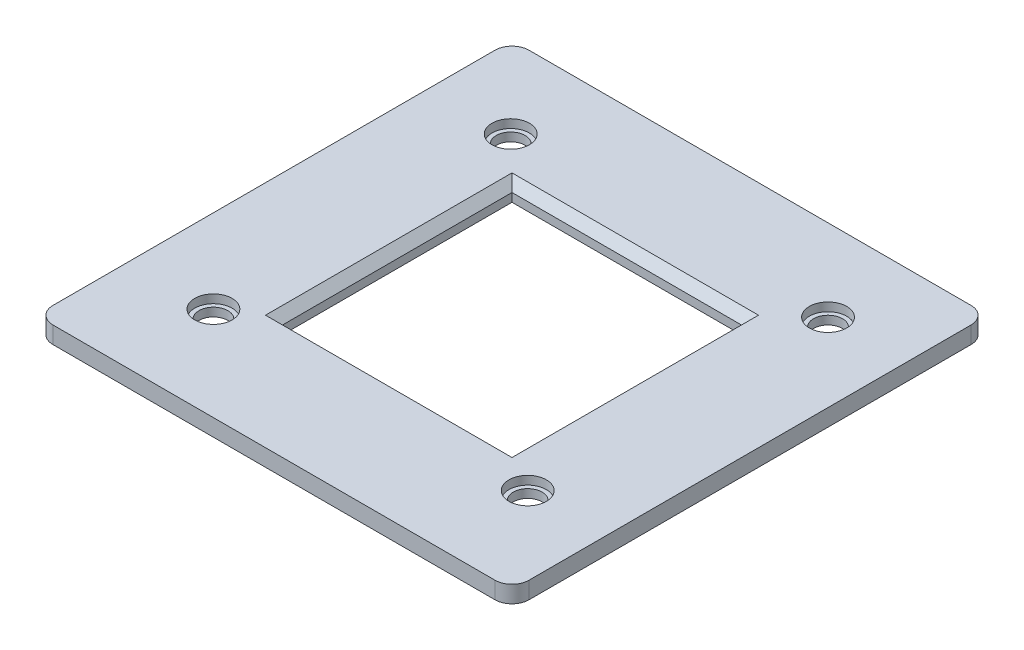
ISO-10303-21;
HEADER;
FILE_DESCRIPTION(('STEP AP214'),'2;1');
FILE_NAME('part.step','',(''),(''),'','','');
FILE_SCHEMA(('AUTOMOTIVE_DESIGN { 1 0 10303 214 1 1 1 1 }'));
ENDSEC;
DATA;
#1=APPLICATION_CONTEXT('core data for automotive mechanical design processes');
#2=APPLICATION_PROTOCOL_DEFINITION('international standard','automotive_design',2000,#1);
#3=PRODUCT_CONTEXT('',#1,'mechanical');
#4=PRODUCT('Part','Part','',(#3));
#5=PRODUCT_RELATED_PRODUCT_CATEGORY('part','',(#4));
#6=PRODUCT_DEFINITION_FORMATION('','',#4);
#7=PRODUCT_DEFINITION_CONTEXT('part definition',#1,'design');
#8=PRODUCT_DEFINITION('design','',#6,#7);
#9=PRODUCT_DEFINITION_SHAPE('','',#8);
#10=(LENGTH_UNIT() NAMED_UNIT(*) SI_UNIT(.MILLI.,.METRE.));
#11=(NAMED_UNIT(*) PLANE_ANGLE_UNIT() SI_UNIT($,.RADIAN.));
#12=(NAMED_UNIT(*) SI_UNIT($,.STERADIAN.) SOLID_ANGLE_UNIT());
#13=UNCERTAINTY_MEASURE_WITH_UNIT(LENGTH_MEASURE(1.E-05),#10,'distance_accuracy_value','');
#14=(GEOMETRIC_REPRESENTATION_CONTEXT(3) GLOBAL_UNCERTAINTY_ASSIGNED_CONTEXT((#13)) GLOBAL_UNIT_ASSIGNED_CONTEXT((#10,
#11,#12)) REPRESENTATION_CONTEXT('',''));
#15=CARTESIAN_POINT('',(0.,0.,0.));
#16=DIRECTION('',(0.,0.,1.));
#17=DIRECTION('',(1.,0.,0.));
#18=AXIS2_PLACEMENT_3D('',#15,#16,#17);
#19=CARTESIAN_POINT('',(0.,2.,0.));
#20=DIRECTION('',(0.,-1.,0.));
#21=DIRECTION('',(0.,0.,-1.));
#22=AXIS2_PLACEMENT_3D('',#19,#20,#21);
#23=PLANE('',#22);
#24=CARTESIAN_POINT('',(9.46189987263134,2.,-46.3842569727847));
#25=DIRECTION('',(0.,1.,0.));
#26=DIRECTION('',(0.,0.,1.));
#27=AXIS2_PLACEMENT_3D('',#24,#25,#26);
#28=CIRCLE('',#27,2.2);
#29=CARTESIAN_POINT('',(9.46189987263134,2.,-44.1842569727847));
#30=VERTEX_POINT('',#29);
#31=EDGE_CURVE('E618',#30,#30,#28,.T.);
#32=ORIENTED_EDGE('',*,*,#31,.F.);
#33=EDGE_LOOP('',(#32));
#34=FACE_BOUND('',#33,.T.);
#35=CARTESIAN_POINT('',(46.7945053850086,2.,-46.3842569727847));
#36=DIRECTION('',(0.,1.,0.));
#37=DIRECTION('',(0.,0.,1.));
#38=AXIS2_PLACEMENT_3D('',#35,#36,#37);
#39=CIRCLE('',#38,2.2);
#40=CARTESIAN_POINT('',(46.7945053850086,2.,-44.1842569727847));
#41=VERTEX_POINT('',#40);
#42=EDGE_CURVE('E235',#41,#41,#39,.T.);
#43=ORIENTED_EDGE('',*,*,#42,.F.);
#44=EDGE_LOOP('',(#43));
#45=FACE_BOUND('',#44,.T.);
#46=CARTESIAN_POINT('',(46.7945053850086,2.,-11.0516124699991));
#47=DIRECTION('',(0.,1.,0.));
#48=DIRECTION('',(0.,0.,1.));
#49=AXIS2_PLACEMENT_3D('',#46,#47,#48);
#50=CIRCLE('',#49,2.2);
#51=CARTESIAN_POINT('',(46.7945053850086,2.,-8.85161246999906));
#52=VERTEX_POINT('',#51);
#53=EDGE_CURVE('E230',#52,#52,#50,.T.);
#54=ORIENTED_EDGE('',*,*,#53,.F.);
#55=EDGE_LOOP('',(#54));
#56=FACE_BOUND('',#55,.T.);
#57=CARTESIAN_POINT('',(9.82086723332727,2.,-11.0516124699991));
#58=DIRECTION('',(0.,1.,0.));
#59=DIRECTION('',(0.,0.,1.));
#60=AXIS2_PLACEMENT_3D('',#57,#58,#59);
#61=CIRCLE('',#60,2.2);
#62=CARTESIAN_POINT('',(9.82086723332727,2.,-8.85161246999906));
#63=VERTEX_POINT('',#62);
#64=EDGE_CURVE('E225',#63,#63,#61,.T.);
#65=ORIENTED_EDGE('',*,*,#64,.F.);
#66=EDGE_LOOP('',(#65));
#67=FACE_BOUND('',#66,.T.);
#68=DIRECTION('',(1.,0.,0.));
#69=VECTOR('',#68,1.);
#70=CARTESIAN_POINT('',(41.5,2.,-42.5));
#71=LINE('',#70,#69);
#72=CARTESIAN_POINT('',(13.5,2.,-42.5));
#73=VERTEX_POINT('',#72);
#74=CARTESIAN_POINT('',(42.5,2.,-42.5));
#75=VERTEX_POINT('',#74);
#76=EDGE_CURVE('E198',#73,#75,#71,.T.);
#77=ORIENTED_EDGE('',*,*,#76,.T.);
#78=DIRECTION('',(0.,0.,1.));
#79=VECTOR('',#78,1.);
#80=CARTESIAN_POINT('',(42.5,2.,-14.5));
#81=LINE('',#80,#79);
#82=CARTESIAN_POINT('',(42.5,2.,-13.5));
#83=VERTEX_POINT('',#82);
#84=EDGE_CURVE('E204',#75,#83,#81,.T.);
#85=ORIENTED_EDGE('',*,*,#84,.T.);
#86=DIRECTION('',(-1.,0.,0.));
#87=VECTOR('',#86,1.);
#88=CARTESIAN_POINT('',(14.5,2.,-13.5));
#89=LINE('',#88,#87);
#90=CARTESIAN_POINT('',(13.5,2.,-13.5));
#91=VERTEX_POINT('',#90);
#92=EDGE_CURVE('E202',#83,#91,#89,.T.);
#93=ORIENTED_EDGE('',*,*,#92,.T.);
#94=DIRECTION('',(0.,0.,-1.));
#95=VECTOR('',#94,1.);
#96=CARTESIAN_POINT('',(13.5,2.,-41.5));
#97=LINE('',#96,#95);
#98=EDGE_CURVE('E200',#91,#73,#97,.T.);
#99=ORIENTED_EDGE('',*,*,#98,.T.);
#100=EDGE_LOOP('',(#77,#85,#93,#99));
#101=FACE_BOUND('',#100,.T.);
#102=DIRECTION('',(0.,0.,-1.));
#103=VECTOR('',#102,1.);
#104=CARTESIAN_POINT('',(56.,2.,0.));
#105=LINE('',#104,#103);
#106=CARTESIAN_POINT('',(56.,2.,-2.));
#107=VERTEX_POINT('',#106);
#108=CARTESIAN_POINT('',(56.,2.,-54.));
#109=VERTEX_POINT('',#108);
#110=EDGE_CURVE('E180',#107,#109,#105,.T.);
#111=ORIENTED_EDGE('',*,*,#110,.T.);
#112=CARTESIAN_POINT('',(54.,2.,-54.));
#113=DIRECTION('',(0.,-1.,0.));
#114=DIRECTION('',(0.,0.,-1.));
#115=AXIS2_PLACEMENT_3D('',#112,#113,#114);
#116=CIRCLE('',#115,2.);
#117=CARTESIAN_POINT('',(54.,2.,-56.));
#118=VERTEX_POINT('',#117);
#119=EDGE_CURVE('E259',#109,#118,#116,.F.);
#120=ORIENTED_EDGE('',*,*,#119,.T.);
#121=DIRECTION('',(-1.,0.,0.));
#122=VECTOR('',#121,1.);
#123=CARTESIAN_POINT('',(0.,2.,-56.));
#124=LINE('',#123,#122);
#125=CARTESIAN_POINT('',(2.,2.,-56.));
#126=VERTEX_POINT('',#125);
#127=EDGE_CURVE('E183',#118,#126,#124,.T.);
#128=ORIENTED_EDGE('',*,*,#127,.T.);
#129=CARTESIAN_POINT('',(2.,2.,-54.));
#130=DIRECTION('',(0.,-1.,0.));
#131=DIRECTION('',(0.,0.,-1.));
#132=AXIS2_PLACEMENT_3D('',#129,#130,#131);
#133=CIRCLE('',#132,2.);
#134=CARTESIAN_POINT('',(0.,2.,-54.));
#135=VERTEX_POINT('',#134);
#136=EDGE_CURVE('E257',#126,#135,#133,.F.);
#137=ORIENTED_EDGE('',*,*,#136,.T.);
#138=DIRECTION('',(0.,0.,1.));
#139=VECTOR('',#138,1.);
#140=CARTESIAN_POINT('',(0.,2.,0.));
#141=LINE('',#140,#139);
#142=CARTESIAN_POINT('',(0.,2.,-2.));
#143=VERTEX_POINT('',#142);
#144=EDGE_CURVE('E175',#135,#143,#141,.T.);
#145=ORIENTED_EDGE('',*,*,#144,.T.);
#146=CARTESIAN_POINT('',(2.,2.,-2.));
#147=DIRECTION('',(0.,-1.,0.));
#148=DIRECTION('',(0.,0.,-1.));
#149=AXIS2_PLACEMENT_3D('',#146,#147,#148);
#150=CIRCLE('',#149,2.);
#151=CARTESIAN_POINT('',(2.,2.,0.));
#152=VERTEX_POINT('',#151);
#153=EDGE_CURVE('E52',#143,#152,#150,.F.);
#154=ORIENTED_EDGE('',*,*,#153,.T.);
#155=DIRECTION('',(1.,0.,0.));
#156=VECTOR('',#155,1.);
#157=CARTESIAN_POINT('',(0.,2.,0.));
#158=LINE('',#157,#156);
#159=CARTESIAN_POINT('',(54.,2.,0.));
#160=VERTEX_POINT('',#159);
#161=EDGE_CURVE('E177',#152,#160,#158,.T.);
#162=ORIENTED_EDGE('',*,*,#161,.T.);
#163=CARTESIAN_POINT('',(54.,2.,-2.));
#164=DIRECTION('',(0.,-1.,0.));
#165=DIRECTION('',(0.,0.,-1.));
#166=AXIS2_PLACEMENT_3D('',#163,#164,#165);
#167=CIRCLE('',#166,2.);
#168=EDGE_CURVE('E255',#160,#107,#167,.F.);
#169=ORIENTED_EDGE('',*,*,#168,.T.);
#170=EDGE_LOOP('',(#111,#120,#128,#137,#145,#154,#162,#169));
#171=FACE_BOUND('',#170,.T.);
#172=ADVANCED_FACE('F32',(#34,#45,#56,#67,#101,#171),#23,.F.);
#173=CARTESIAN_POINT('',(0.,0.,0.));
#174=DIRECTION('',(0.,-1.,0.));
#175=DIRECTION('',(0.,0.,-1.));
#176=AXIS2_PLACEMENT_3D('',#173,#174,#175);
#177=PLANE('',#176);
#178=CARTESIAN_POINT('',(9.46189987263134,0.,-46.3842569727847));
#179=DIRECTION('',(0.,-1.,0.));
#180=DIRECTION('',(0.,0.,-1.));
#181=AXIS2_PLACEMENT_3D('',#178,#179,#180);
#182=CIRCLE('',#181,1.7);
#183=CARTESIAN_POINT('',(9.46189987263134,0.,-48.0842569727847));
#184=VERTEX_POINT('',#183);
#185=EDGE_CURVE('E232',#184,#184,#182,.T.);
#186=ORIENTED_EDGE('',*,*,#185,.F.);
#187=EDGE_LOOP('',(#186));
#188=FACE_BOUND('',#187,.T.);
#189=CARTESIAN_POINT('',(46.7945053850086,0.,-46.3842569727847));
#190=DIRECTION('',(0.,-1.,0.));
#191=DIRECTION('',(0.,0.,-1.));
#192=AXIS2_PLACEMENT_3D('',#189,#190,#191);
#193=CIRCLE('',#192,1.7);
#194=CARTESIAN_POINT('',(46.7945053850086,0.,-48.0842569727847));
#195=VERTEX_POINT('',#194);
#196=EDGE_CURVE('E227',#195,#195,#193,.T.);
#197=ORIENTED_EDGE('',*,*,#196,.F.);
#198=EDGE_LOOP('',(#197));
#199=FACE_BOUND('',#198,.T.);
#200=CARTESIAN_POINT('',(46.7945053850086,0.,-11.0516124699991));
#201=DIRECTION('',(0.,-1.,0.));
#202=DIRECTION('',(0.,0.,-1.));
#203=AXIS2_PLACEMENT_3D('',#200,#201,#202);
#204=CIRCLE('',#203,1.7);
#205=CARTESIAN_POINT('',(46.7945053850086,0.,-12.7516124699991));
#206=VERTEX_POINT('',#205);
#207=EDGE_CURVE('E222',#206,#206,#204,.T.);
#208=ORIENTED_EDGE('',*,*,#207,.F.);
#209=EDGE_LOOP('',(#208));
#210=FACE_BOUND('',#209,.T.);
#211=CARTESIAN_POINT('',(9.82086723332727,0.,-11.0516124699991));
#212=DIRECTION('',(0.,-1.,0.));
#213=DIRECTION('',(0.,0.,-1.));
#214=AXIS2_PLACEMENT_3D('',#211,#212,#213);
#215=CIRCLE('',#214,1.7);
#216=CARTESIAN_POINT('',(9.82086723332727,0.,-12.7516124699991));
#217=VERTEX_POINT('',#216);
#218=EDGE_CURVE('E216',#217,#217,#215,.T.);
#219=ORIENTED_EDGE('',*,*,#218,.F.);
#220=EDGE_LOOP('',(#219));
#221=FACE_BOUND('',#220,.T.);
#222=DIRECTION('',(-1.,0.,0.));
#223=VECTOR('',#222,1.);
#224=CARTESIAN_POINT('',(0.,0.,-56.));
#225=LINE('',#224,#223);
#226=CARTESIAN_POINT('',(54.,0.,-56.));
#227=VERTEX_POINT('',#226);
#228=CARTESIAN_POINT('',(2.,0.,-56.));
#229=VERTEX_POINT('',#228);
#230=EDGE_CURVE('E178',#227,#229,#225,.T.);
#231=ORIENTED_EDGE('',*,*,#230,.F.);
#232=CARTESIAN_POINT('',(54.,0.,-54.));
#233=DIRECTION('',(0.,-1.,0.));
#234=DIRECTION('',(0.,0.,-1.));
#235=AXIS2_PLACEMENT_3D('',#232,#233,#234);
#236=CIRCLE('',#235,2.);
#237=CARTESIAN_POINT('',(56.,0.,-54.));
#238=VERTEX_POINT('',#237);
#239=EDGE_CURVE('E247',#227,#238,#236,.T.);
#240=ORIENTED_EDGE('',*,*,#239,.T.);
#241=DIRECTION('',(0.,0.,-1.));
#242=VECTOR('',#241,1.);
#243=CARTESIAN_POINT('',(56.,0.,0.));
#244=LINE('',#243,#242);
#245=CARTESIAN_POINT('',(56.,0.,-2.));
#246=VERTEX_POINT('',#245);
#247=EDGE_CURVE('E191',#246,#238,#244,.T.);
#248=ORIENTED_EDGE('',*,*,#247,.F.);
#249=CARTESIAN_POINT('',(54.,0.,-2.));
#250=DIRECTION('',(0.,-1.,0.));
#251=DIRECTION('',(0.,0.,-1.));
#252=AXIS2_PLACEMENT_3D('',#249,#250,#251);
#253=CIRCLE('',#252,2.);
#254=CARTESIAN_POINT('',(54.,0.,0.));
#255=VERTEX_POINT('',#254);
#256=EDGE_CURVE('E243',#246,#255,#253,.T.);
#257=ORIENTED_EDGE('',*,*,#256,.T.);
#258=DIRECTION('',(1.,0.,0.));
#259=VECTOR('',#258,1.);
#260=CARTESIAN_POINT('',(0.,0.,0.));
#261=LINE('',#260,#259);
#262=CARTESIAN_POINT('',(2.,0.,0.));
#263=VERTEX_POINT('',#262);
#264=EDGE_CURVE('E189',#263,#255,#261,.T.);
#265=ORIENTED_EDGE('',*,*,#264,.F.);
#266=CARTESIAN_POINT('',(2.,0.,-2.));
#267=DIRECTION('',(0.,-1.,0.));
#268=DIRECTION('',(0.,0.,-1.));
#269=AXIS2_PLACEMENT_3D('',#266,#267,#268);
#270=CIRCLE('',#269,2.);
#271=CARTESIAN_POINT('',(0.,0.,-2.));
#272=VERTEX_POINT('',#271);
#273=EDGE_CURVE('E241',#263,#272,#270,.T.);
#274=ORIENTED_EDGE('',*,*,#273,.T.);
#275=DIRECTION('',(0.,0.,1.));
#276=VECTOR('',#275,1.);
#277=CARTESIAN_POINT('',(0.,0.,0.));
#278=LINE('',#277,#276);
#279=CARTESIAN_POINT('',(0.,0.,-54.));
#280=VERTEX_POINT('',#279);
#281=EDGE_CURVE('E144',#280,#272,#278,.T.);
#282=ORIENTED_EDGE('',*,*,#281,.F.);
#283=CARTESIAN_POINT('',(2.,0.,-54.));
#284=DIRECTION('',(0.,-1.,0.));
#285=DIRECTION('',(0.,0.,-1.));
#286=AXIS2_PLACEMENT_3D('',#283,#284,#285);
#287=CIRCLE('',#286,2.);
#288=EDGE_CURVE('E245',#280,#229,#287,.T.);
#289=ORIENTED_EDGE('',*,*,#288,.T.);
#290=EDGE_LOOP('',(#231,#240,#248,#257,#265,#274,#282,#289));
#291=FACE_BOUND('',#290,.T.);
#292=DIRECTION('',(-1.,0.,0.));
#293=VECTOR('',#292,1.);
#294=CARTESIAN_POINT('',(14.5,0.,-41.5));
#295=LINE('',#294,#293);
#296=CARTESIAN_POINT('',(41.5,0.,-41.5));
#297=VERTEX_POINT('',#296);
#298=CARTESIAN_POINT('',(14.5,0.,-41.5));
#299=VERTEX_POINT('',#298);
#300=EDGE_CURVE('E158',#297,#299,#295,.T.);
#301=ORIENTED_EDGE('',*,*,#300,.T.);
#302=DIRECTION('',(0.,0.,1.));
#303=VECTOR('',#302,1.);
#304=CARTESIAN_POINT('',(14.5,0.,-14.5));
#305=LINE('',#304,#303);
#306=CARTESIAN_POINT('',(14.5,0.,-14.5));
#307=VERTEX_POINT('',#306);
#308=EDGE_CURVE('E138',#299,#307,#305,.T.);
#309=ORIENTED_EDGE('',*,*,#308,.T.);
#310=DIRECTION('',(1.,0.,0.));
#311=VECTOR('',#310,1.);
#312=CARTESIAN_POINT('',(14.5,0.,-14.5));
#313=LINE('',#312,#311);
#314=CARTESIAN_POINT('',(41.5,0.,-14.5));
#315=VERTEX_POINT('',#314);
#316=EDGE_CURVE('E148',#307,#315,#313,.T.);
#317=ORIENTED_EDGE('',*,*,#316,.T.);
#318=DIRECTION('',(0.,0.,-1.));
#319=VECTOR('',#318,1.);
#320=CARTESIAN_POINT('',(41.5,0.,-14.5));
#321=LINE('',#320,#319);
#322=EDGE_CURVE('E154',#315,#297,#321,.T.);
#323=ORIENTED_EDGE('',*,*,#322,.T.);
#324=EDGE_LOOP('',(#301,#309,#317,#323));
#325=FACE_BOUND('',#324,.T.);
#326=ADVANCED_FACE('F156',(#188,#199,#210,#221,#291,#325),#177,.T.);
#327=CARTESIAN_POINT('',(0.,2.,0.));
#328=DIRECTION('',(1.,0.,0.));
#329=DIRECTION('',(0.,0.,-1.));
#330=AXIS2_PLACEMENT_3D('',#327,#328,#329);
#331=PLANE('',#330);
#332=ORIENTED_EDGE('',*,*,#144,.F.);
#333=DIRECTION('',(0.,-1.,0.));
#334=VECTOR('',#333,1.);
#335=CARTESIAN_POINT('',(0.,2.,-54.));
#336=LINE('',#335,#334);
#337=EDGE_CURVE('E263',#135,#280,#336,.T.);
#338=ORIENTED_EDGE('',*,*,#337,.T.);
#339=ORIENTED_EDGE('',*,*,#281,.T.);
#340=DIRECTION('',(0.,-1.,0.));
#341=VECTOR('',#340,1.);
#342=CARTESIAN_POINT('',(0.,2.,-2.));
#343=LINE('',#342,#341);
#344=EDGE_CURVE('E261',#272,#143,#343,.F.);
#345=ORIENTED_EDGE('',*,*,#344,.T.);
#346=EDGE_LOOP('',(#332,#338,#339,#345));
#347=FACE_BOUND('',#346,.T.);
#348=ADVANCED_FACE('F296',(#347),#331,.F.);
#349=CARTESIAN_POINT('',(0.,2.,0.));
#350=DIRECTION('',(0.,0.,-1.));
#351=DIRECTION('',(-1.,0.,0.));
#352=AXIS2_PLACEMENT_3D('',#349,#350,#351);
#353=PLANE('',#352);
#354=ORIENTED_EDGE('',*,*,#264,.T.);
#355=DIRECTION('',(0.,-1.,0.));
#356=VECTOR('',#355,1.);
#357=CARTESIAN_POINT('',(54.,2.,0.));
#358=LINE('',#357,#356);
#359=EDGE_CURVE('E11',#255,#160,#358,.F.);
#360=ORIENTED_EDGE('',*,*,#359,.T.);
#361=ORIENTED_EDGE('',*,*,#161,.F.);
#362=DIRECTION('',(0.,-1.,0.));
#363=VECTOR('',#362,1.);
#364=CARTESIAN_POINT('',(2.,2.,0.));
#365=LINE('',#364,#363);
#366=EDGE_CURVE('E40',#152,#263,#365,.T.);
#367=ORIENTED_EDGE('',*,*,#366,.T.);
#368=EDGE_LOOP('',(#354,#360,#361,#367));
#369=FACE_BOUND('',#368,.T.);
#370=ADVANCED_FACE('F268',(#369),#353,.F.);
#371=CARTESIAN_POINT('',(56.,2.,0.));
#372=DIRECTION('',(-1.,0.,0.));
#373=DIRECTION('',(0.,0.,1.));
#374=AXIS2_PLACEMENT_3D('',#371,#372,#373);
#375=PLANE('',#374);
#376=ORIENTED_EDGE('',*,*,#247,.T.);
#377=DIRECTION('',(0.,-1.,0.));
#378=VECTOR('',#377,1.);
#379=CARTESIAN_POINT('',(56.,2.,-54.));
#380=LINE('',#379,#378);
#381=EDGE_CURVE('E252',#238,#109,#380,.F.);
#382=ORIENTED_EDGE('',*,*,#381,.T.);
#383=ORIENTED_EDGE('',*,*,#110,.F.);
#384=DIRECTION('',(0.,-1.,0.));
#385=VECTOR('',#384,1.);
#386=CARTESIAN_POINT('',(56.,2.,-2.));
#387=LINE('',#386,#385);
#388=EDGE_CURVE('E249',#107,#246,#387,.T.);
#389=ORIENTED_EDGE('',*,*,#388,.T.);
#390=EDGE_LOOP('',(#376,#382,#383,#389));
#391=FACE_BOUND('',#390,.T.);
#392=ADVANCED_FACE('F280',(#391),#375,.F.);
#393=CARTESIAN_POINT('',(0.,2.,-56.));
#394=DIRECTION('',(0.,0.,1.));
#395=DIRECTION('',(1.,0.,0.));
#396=AXIS2_PLACEMENT_3D('',#393,#394,#395);
#397=PLANE('',#396);
#398=ORIENTED_EDGE('',*,*,#127,.F.);
#399=DIRECTION('',(0.,-1.,0.));
#400=VECTOR('',#399,1.);
#401=CARTESIAN_POINT('',(54.,2.,-56.));
#402=LINE('',#401,#400);
#403=EDGE_CURVE('E238',#118,#227,#402,.T.);
#404=ORIENTED_EDGE('',*,*,#403,.T.);
#405=ORIENTED_EDGE('',*,*,#230,.T.);
#406=DIRECTION('',(0.,-1.,0.));
#407=VECTOR('',#406,1.);
#408=CARTESIAN_POINT('',(2.,2.,-56.));
#409=LINE('',#408,#407);
#410=EDGE_CURVE('E212',#229,#126,#409,.F.);
#411=ORIENTED_EDGE('',*,*,#410,.T.);
#412=EDGE_LOOP('',(#398,#404,#405,#411));
#413=FACE_BOUND('',#412,.T.);
#414=ADVANCED_FACE('F288',(#413),#397,.F.);
#415=CARTESIAN_POINT('',(14.5,2.,-14.5));
#416=DIRECTION('',(1.,0.,0.));
#417=DIRECTION('',(0.,0.,-1.));
#418=AXIS2_PLACEMENT_3D('',#415,#416,#417);
#419=PLANE('',#418);
#420=DIRECTION('',(0.,-1.,0.));
#421=VECTOR('',#420,1.);
#422=CARTESIAN_POINT('',(14.5,2.,-41.5));
#423=LINE('',#422,#421);
#424=CARTESIAN_POINT('',(14.5,0.999999999999992,-41.5));
#425=VERTEX_POINT('',#424);
#426=EDGE_CURVE('E170',#425,#299,#423,.T.);
#427=ORIENTED_EDGE('',*,*,#426,.F.);
#428=DIRECTION('',(0.,0.,1.));
#429=VECTOR('',#428,1.);
#430=CARTESIAN_POINT('',(14.5,0.999999999999992,-14.5));
#431=LINE('',#430,#429);
#432=CARTESIAN_POINT('',(14.5,0.999999999999992,-14.5));
#433=VERTEX_POINT('',#432);
#434=EDGE_CURVE('E141',#425,#433,#431,.T.);
#435=ORIENTED_EDGE('',*,*,#434,.T.);
#436=DIRECTION('',(0.,-1.,0.));
#437=VECTOR('',#436,1.);
#438=CARTESIAN_POINT('',(14.5,2.,-14.5));
#439=LINE('',#438,#437);
#440=EDGE_CURVE('E133',#433,#307,#439,.T.);
#441=ORIENTED_EDGE('',*,*,#440,.T.);
#442=ORIENTED_EDGE('',*,*,#308,.F.);
#443=EDGE_LOOP('',(#427,#435,#441,#442));
#444=FACE_BOUND('',#443,.T.);
#445=ADVANCED_FACE('F136',(#444),#419,.T.);
#446=CARTESIAN_POINT('',(14.5,2.,-14.5));
#447=DIRECTION('',(0.,0.,-1.));
#448=DIRECTION('',(-1.,0.,0.));
#449=AXIS2_PLACEMENT_3D('',#446,#447,#448);
#450=PLANE('',#449);
#451=ORIENTED_EDGE('',*,*,#440,.F.);
#452=DIRECTION('',(1.,0.,0.));
#453=VECTOR('',#452,1.);
#454=CARTESIAN_POINT('',(41.5,0.999999999999992,-14.5));
#455=LINE('',#454,#453);
#456=CARTESIAN_POINT('',(41.5,0.999999999999992,-14.5));
#457=VERTEX_POINT('',#456);
#458=EDGE_CURVE('E207',#433,#457,#455,.T.);
#459=ORIENTED_EDGE('',*,*,#458,.T.);
#460=DIRECTION('',(0.,-1.,0.));
#461=VECTOR('',#460,1.);
#462=CARTESIAN_POINT('',(41.5,2.,-14.5));
#463=LINE('',#462,#461);
#464=EDGE_CURVE('E145',#457,#315,#463,.T.);
#465=ORIENTED_EDGE('',*,*,#464,.T.);
#466=ORIENTED_EDGE('',*,*,#316,.F.);
#467=EDGE_LOOP('',(#451,#459,#465,#466));
#468=FACE_BOUND('',#467,.T.);
#469=ADVANCED_FACE('F149',(#468),#450,.T.);
#470=CARTESIAN_POINT('',(41.5,2.,-14.5));
#471=DIRECTION('',(-1.,0.,0.));
#472=DIRECTION('',(0.,0.,1.));
#473=AXIS2_PLACEMENT_3D('',#470,#471,#472);
#474=PLANE('',#473);
#475=ORIENTED_EDGE('',*,*,#464,.F.);
#476=DIRECTION('',(0.,0.,-1.));
#477=VECTOR('',#476,1.);
#478=CARTESIAN_POINT('',(41.5,0.999999999999992,-41.5));
#479=LINE('',#478,#477);
#480=CARTESIAN_POINT('',(41.5,0.999999999999992,-41.5));
#481=VERTEX_POINT('',#480);
#482=EDGE_CURVE('E186',#457,#481,#479,.T.);
#483=ORIENTED_EDGE('',*,*,#482,.T.);
#484=DIRECTION('',(0.,-1.,0.));
#485=VECTOR('',#484,1.);
#486=CARTESIAN_POINT('',(41.5,2.,-41.5));
#487=LINE('',#486,#485);
#488=EDGE_CURVE('E172',#481,#297,#487,.T.);
#489=ORIENTED_EDGE('',*,*,#488,.T.);
#490=ORIENTED_EDGE('',*,*,#322,.F.);
#491=EDGE_LOOP('',(#475,#483,#489,#490));
#492=FACE_BOUND('',#491,.T.);
#493=ADVANCED_FACE('F500',(#492),#474,.T.);
#494=CARTESIAN_POINT('',(14.5,2.,-41.5));
#495=DIRECTION('',(0.,0.,1.));
#496=DIRECTION('',(1.,0.,0.));
#497=AXIS2_PLACEMENT_3D('',#494,#495,#496);
#498=PLANE('',#497);
#499=ORIENTED_EDGE('',*,*,#488,.F.);
#500=DIRECTION('',(-1.,0.,0.));
#501=VECTOR('',#500,1.);
#502=CARTESIAN_POINT('',(14.5,0.999999999999992,-41.5));
#503=LINE('',#502,#501);
#504=EDGE_CURVE('E210',#481,#425,#503,.T.);
#505=ORIENTED_EDGE('',*,*,#504,.T.);
#506=ORIENTED_EDGE('',*,*,#426,.T.);
#507=ORIENTED_EDGE('',*,*,#300,.F.);
#508=EDGE_LOOP('',(#499,#505,#506,#507));
#509=FACE_BOUND('',#508,.T.);
#510=ADVANCED_FACE('F339',(#509),#498,.T.);
#511=CARTESIAN_POINT('',(14.5,0.999999999999992,-14.5));
#512=DIRECTION('',(0.707106781186547,0.707106781186548,0.));
#513=DIRECTION('',(0.,0.,-1.));
#514=AXIS2_PLACEMENT_3D('',#511,#512,#513);
#515=PLANE('',#514);
#516=DIRECTION('',(0.577350269189626,-0.577350269189626,0.577350269189626));
#517=VECTOR('',#516,1.);
#518=CARTESIAN_POINT('',(23.5,-8.,-32.5));
#519=LINE('',#518,#517);
#520=EDGE_CURVE('E162',#73,#425,#519,.T.);
#521=ORIENTED_EDGE('',*,*,#520,.F.);
#522=ORIENTED_EDGE('',*,*,#98,.F.);
#523=DIRECTION('',(0.577350269189626,-0.577350269189626,-0.577350269189626));
#524=VECTOR('',#523,1.);
#525=CARTESIAN_POINT('',(14.5,0.999999999999992,-14.5));
#526=LINE('',#525,#524);
#527=EDGE_CURVE('E159',#433,#91,#526,.F.);
#528=ORIENTED_EDGE('',*,*,#527,.F.);
#529=ORIENTED_EDGE('',*,*,#434,.F.);
#530=EDGE_LOOP('',(#521,#522,#528,#529));
#531=FACE_BOUND('',#530,.T.);
#532=ADVANCED_FACE('F335',(#531),#515,.T.);
#533=CARTESIAN_POINT('',(14.5,0.999999999999992,-14.5));
#534=DIRECTION('',(0.,0.707106781186547,-0.707106781186547));
#535=DIRECTION('',(-1.,0.,0.));
#536=AXIS2_PLACEMENT_3D('',#533,#534,#535);
#537=PLANE('',#536);
#538=ORIENTED_EDGE('',*,*,#527,.T.);
#539=ORIENTED_EDGE('',*,*,#92,.F.);
#540=DIRECTION('',(-0.577350269189626,-0.577350269189626,-0.577350269189626));
#541=VECTOR('',#540,1.);
#542=CARTESIAN_POINT('',(41.5,0.999999999999992,-14.5));
#543=LINE('',#542,#541);
#544=EDGE_CURVE('E215',#457,#83,#543,.F.);
#545=ORIENTED_EDGE('',*,*,#544,.F.);
#546=ORIENTED_EDGE('',*,*,#458,.F.);
#547=EDGE_LOOP('',(#538,#539,#545,#546));
#548=FACE_BOUND('',#547,.T.);
#549=ADVANCED_FACE('F331',(#548),#537,.T.);
#550=CARTESIAN_POINT('',(14.5,0.999999999999992,-41.5));
#551=DIRECTION('',(0.,0.707106781186547,0.707106781186547));
#552=DIRECTION('',(1.,0.,0.));
#553=AXIS2_PLACEMENT_3D('',#550,#551,#552);
#554=PLANE('',#553);
#555=ORIENTED_EDGE('',*,*,#520,.T.);
#556=ORIENTED_EDGE('',*,*,#504,.F.);
#557=DIRECTION('',(0.577350269189626,0.577350269189626,-0.577350269189626));
#558=VECTOR('',#557,1.);
#559=CARTESIAN_POINT('',(32.5,-8.00000000000001,-32.5));
#560=LINE('',#559,#558);
#561=EDGE_CURVE('E213',#75,#481,#560,.F.);
#562=ORIENTED_EDGE('',*,*,#561,.F.);
#563=ORIENTED_EDGE('',*,*,#76,.F.);
#564=EDGE_LOOP('',(#555,#556,#562,#563));
#565=FACE_BOUND('',#564,.T.);
#566=ADVANCED_FACE('F327',(#565),#554,.T.);
#567=CARTESIAN_POINT('',(41.5,0.999999999999992,-14.5));
#568=DIRECTION('',(-0.707106781186547,0.707106781186547,0.));
#569=DIRECTION('',(0.,0.,1.));
#570=AXIS2_PLACEMENT_3D('',#567,#568,#569);
#571=PLANE('',#570);
#572=ORIENTED_EDGE('',*,*,#544,.T.);
#573=ORIENTED_EDGE('',*,*,#84,.F.);
#574=ORIENTED_EDGE('',*,*,#561,.T.);
#575=ORIENTED_EDGE('',*,*,#482,.F.);
#576=EDGE_LOOP('',(#572,#573,#574,#575));
#577=FACE_BOUND('',#576,.T.);
#578=ADVANCED_FACE('F323',(#577),#571,.T.);
#579=CARTESIAN_POINT('',(9.82086723332727,2.,-11.0516124699991));
#580=DIRECTION('',(0.,1.,0.));
#581=DIRECTION('',(0.,0.,1.));
#582=AXIS2_PLACEMENT_3D('',#579,#580,#581);
#583=CYLINDRICAL_SURFACE('',#582,1.7);
#584=ORIENTED_EDGE('',*,*,#218,.T.);
#585=EDGE_LOOP('',(#584));
#586=FACE_BOUND('',#585,.T.);
#587=CARTESIAN_POINT('',(9.82086723332727,1.,-11.0516124699991));
#588=DIRECTION('',(0.,1.,0.));
#589=DIRECTION('',(0.,0.,1.));
#590=AXIS2_PLACEMENT_3D('',#587,#588,#589);
#591=CIRCLE('',#590,1.7);
#592=CARTESIAN_POINT('',(9.82086723332727,1.,-9.35161246999906));
#593=VERTEX_POINT('',#592);
#594=EDGE_CURVE('E165',#593,#593,#591,.T.);
#595=ORIENTED_EDGE('',*,*,#594,.T.);
#596=EDGE_LOOP('',(#595));
#597=FACE_BOUND('',#596,.T.);
#598=ADVANCED_FACE('F326',(#586,#597),#583,.F.);
#599=CARTESIAN_POINT('',(11.5208672333273,1.,-11.0516124699991));
#600=DIRECTION('',(0.,-1.,0.));
#601=DIRECTION('',(0.,0.,-1.));
#602=AXIS2_PLACEMENT_3D('',#599,#600,#601);
#603=PLANE('',#602);
#604=ORIENTED_EDGE('',*,*,#594,.F.);
#605=EDGE_LOOP('',(#604));
#606=FACE_BOUND('',#605,.T.);
#607=CARTESIAN_POINT('',(9.82086723332727,1.,-11.0516124699991));
#608=DIRECTION('',(0.,1.,0.));
#609=DIRECTION('',(0.,0.,1.));
#610=AXIS2_PLACEMENT_3D('',#607,#608,#609);
#611=CIRCLE('',#610,2.2);
#612=CARTESIAN_POINT('',(9.82086723332727,1.,-8.85161246999906));
#613=VERTEX_POINT('',#612);
#614=EDGE_CURVE('E592',#613,#613,#611,.T.);
#615=ORIENTED_EDGE('',*,*,#614,.T.);
#616=EDGE_LOOP('',(#615));
#617=FACE_BOUND('',#616,.T.);
#618=ADVANCED_FACE('F455',(#606,#617),#603,.F.);
#619=CARTESIAN_POINT('',(9.82086723332727,2.,-11.0516124699991));
#620=DIRECTION('',(0.,1.,0.));
#621=DIRECTION('',(0.,0.,1.));
#622=AXIS2_PLACEMENT_3D('',#619,#620,#621);
#623=CYLINDRICAL_SURFACE('',#622,2.2);
#624=ORIENTED_EDGE('',*,*,#614,.F.);
#625=EDGE_LOOP('',(#624));
#626=FACE_BOUND('',#625,.T.);
#627=ORIENTED_EDGE('',*,*,#64,.T.);
#628=EDGE_LOOP('',(#627));
#629=FACE_BOUND('',#628,.T.);
#630=ADVANCED_FACE('F446',(#626,#629),#623,.F.);
#631=CARTESIAN_POINT('',(46.7945053850086,2.,-11.0516124699991));
#632=DIRECTION('',(0.,1.,0.));
#633=DIRECTION('',(0.,0.,1.));
#634=AXIS2_PLACEMENT_3D('',#631,#632,#633);
#635=CYLINDRICAL_SURFACE('',#634,1.7);
#636=ORIENTED_EDGE('',*,*,#207,.T.);
#637=EDGE_LOOP('',(#636));
#638=FACE_BOUND('',#637,.T.);
#639=CARTESIAN_POINT('',(46.7945053850086,1.,-11.0516124699991));
#640=DIRECTION('',(0.,1.,0.));
#641=DIRECTION('',(0.,0.,1.));
#642=AXIS2_PLACEMENT_3D('',#639,#640,#641);
#643=CIRCLE('',#642,1.7);
#644=CARTESIAN_POINT('',(46.7945053850086,1.,-9.35161246999906));
#645=VERTEX_POINT('',#644);
#646=EDGE_CURVE('E226',#645,#645,#643,.T.);
#647=ORIENTED_EDGE('',*,*,#646,.T.);
#648=EDGE_LOOP('',(#647));
#649=FACE_BOUND('',#648,.T.);
#650=ADVANCED_FACE('F437',(#638,#649),#635,.F.);
#651=CARTESIAN_POINT('',(48.4945053850086,1.,-11.0516124699991));
#652=DIRECTION('',(0.,-1.,0.));
#653=DIRECTION('',(0.,0.,-1.));
#654=AXIS2_PLACEMENT_3D('',#651,#652,#653);
#655=PLANE('',#654);
#656=ORIENTED_EDGE('',*,*,#646,.F.);
#657=EDGE_LOOP('',(#656));
#658=FACE_BOUND('',#657,.T.);
#659=CARTESIAN_POINT('',(46.7945053850086,1.,-11.0516124699991));
#660=DIRECTION('',(0.,1.,0.));
#661=DIRECTION('',(0.,0.,1.));
#662=AXIS2_PLACEMENT_3D('',#659,#660,#661);
#663=CIRCLE('',#662,2.2);
#664=CARTESIAN_POINT('',(46.7945053850086,1.,-8.85161246999906));
#665=VERTEX_POINT('',#664);
#666=EDGE_CURVE('E601',#665,#665,#663,.T.);
#667=ORIENTED_EDGE('',*,*,#666,.T.);
#668=EDGE_LOOP('',(#667));
#669=FACE_BOUND('',#668,.T.);
#670=ADVANCED_FACE('F428',(#658,#669),#655,.F.);
#671=CARTESIAN_POINT('',(46.7945053850086,2.,-11.0516124699991));
#672=DIRECTION('',(0.,1.,0.));
#673=DIRECTION('',(0.,0.,1.));
#674=AXIS2_PLACEMENT_3D('',#671,#672,#673);
#675=CYLINDRICAL_SURFACE('',#674,2.2);
#676=ORIENTED_EDGE('',*,*,#666,.F.);
#677=EDGE_LOOP('',(#676));
#678=FACE_BOUND('',#677,.T.);
#679=ORIENTED_EDGE('',*,*,#53,.T.);
#680=EDGE_LOOP('',(#679));
#681=FACE_BOUND('',#680,.T.);
#682=ADVANCED_FACE('F419',(#678,#681),#675,.F.);
#683=CARTESIAN_POINT('',(46.7945053850086,2.,-46.3842569727847));
#684=DIRECTION('',(0.,1.,0.));
#685=DIRECTION('',(0.,0.,1.));
#686=AXIS2_PLACEMENT_3D('',#683,#684,#685);
#687=CYLINDRICAL_SURFACE('',#686,1.7);
#688=ORIENTED_EDGE('',*,*,#196,.T.);
#689=EDGE_LOOP('',(#688));
#690=FACE_BOUND('',#689,.T.);
#691=CARTESIAN_POINT('',(46.7945053850086,1.,-46.3842569727847));
#692=DIRECTION('',(0.,1.,0.));
#693=DIRECTION('',(0.,0.,1.));
#694=AXIS2_PLACEMENT_3D('',#691,#692,#693);
#695=CIRCLE('',#694,1.7);
#696=CARTESIAN_POINT('',(46.7945053850086,1.,-44.6842569727847));
#697=VERTEX_POINT('',#696);
#698=EDGE_CURVE('E231',#697,#697,#695,.T.);
#699=ORIENTED_EDGE('',*,*,#698,.T.);
#700=EDGE_LOOP('',(#699));
#701=FACE_BOUND('',#700,.T.);
#702=ADVANCED_FACE('F410',(#690,#701),#687,.F.);
#703=CARTESIAN_POINT('',(48.4945053850086,1.,-46.3842569727847));
#704=DIRECTION('',(0.,-1.,0.));
#705=DIRECTION('',(0.,0.,-1.));
#706=AXIS2_PLACEMENT_3D('',#703,#704,#705);
#707=PLANE('',#706);
#708=ORIENTED_EDGE('',*,*,#698,.F.);
#709=EDGE_LOOP('',(#708));
#710=FACE_BOUND('',#709,.T.);
#711=CARTESIAN_POINT('',(46.7945053850086,1.,-46.3842569727847));
#712=DIRECTION('',(0.,1.,0.));
#713=DIRECTION('',(0.,0.,1.));
#714=AXIS2_PLACEMENT_3D('',#711,#712,#713);
#715=CIRCLE('',#714,2.2);
#716=CARTESIAN_POINT('',(46.7945053850086,1.,-44.1842569727847));
#717=VERTEX_POINT('',#716);
#718=EDGE_CURVE('E608',#717,#717,#715,.T.);
#719=ORIENTED_EDGE('',*,*,#718,.T.);
#720=EDGE_LOOP('',(#719));
#721=FACE_BOUND('',#720,.T.);
#722=ADVANCED_FACE('F401',(#710,#721),#707,.F.);
#723=CARTESIAN_POINT('',(46.7945053850086,2.,-46.3842569727847));
#724=DIRECTION('',(0.,1.,0.));
#725=DIRECTION('',(0.,0.,1.));
#726=AXIS2_PLACEMENT_3D('',#723,#724,#725);
#727=CYLINDRICAL_SURFACE('',#726,2.2);
#728=ORIENTED_EDGE('',*,*,#718,.F.);
#729=EDGE_LOOP('',(#728));
#730=FACE_BOUND('',#729,.T.);
#731=ORIENTED_EDGE('',*,*,#42,.T.);
#732=EDGE_LOOP('',(#731));
#733=FACE_BOUND('',#732,.T.);
#734=ADVANCED_FACE('F392',(#730,#733),#727,.F.);
#735=CARTESIAN_POINT('',(9.46189987263134,2.,-46.3842569727847));
#736=DIRECTION('',(0.,1.,0.));
#737=DIRECTION('',(0.,0.,1.));
#738=AXIS2_PLACEMENT_3D('',#735,#736,#737);
#739=CYLINDRICAL_SURFACE('',#738,1.7);
#740=ORIENTED_EDGE('',*,*,#185,.T.);
#741=EDGE_LOOP('',(#740));
#742=FACE_BOUND('',#741,.T.);
#743=CARTESIAN_POINT('',(9.46189987263134,1.,-46.3842569727847));
#744=DIRECTION('',(0.,1.,0.));
#745=DIRECTION('',(0.,0.,1.));
#746=AXIS2_PLACEMENT_3D('',#743,#744,#745);
#747=CIRCLE('',#746,1.7);
#748=CARTESIAN_POINT('',(9.46189987263134,1.,-44.6842569727847));
#749=VERTEX_POINT('',#748);
#750=EDGE_CURVE('E236',#749,#749,#747,.T.);
#751=ORIENTED_EDGE('',*,*,#750,.T.);
#752=EDGE_LOOP('',(#751));
#753=FACE_BOUND('',#752,.T.);
#754=ADVANCED_FACE('F383',(#742,#753),#739,.F.);
#755=CARTESIAN_POINT('',(11.1618998726313,1.,-46.3842569727847));
#756=DIRECTION('',(0.,-1.,0.));
#757=DIRECTION('',(0.,0.,-1.));
#758=AXIS2_PLACEMENT_3D('',#755,#756,#757);
#759=PLANE('',#758);
#760=ORIENTED_EDGE('',*,*,#750,.F.);
#761=EDGE_LOOP('',(#760));
#762=FACE_BOUND('',#761,.T.);
#763=CARTESIAN_POINT('',(9.46189987263134,1.,-46.3842569727847));
#764=DIRECTION('',(0.,1.,0.));
#765=DIRECTION('',(0.,0.,1.));
#766=AXIS2_PLACEMENT_3D('',#763,#764,#765);
#767=CIRCLE('',#766,2.2);
#768=CARTESIAN_POINT('',(9.46189987263134,1.,-44.1842569727847));
#769=VERTEX_POINT('',#768);
#770=EDGE_CURVE('E615',#769,#769,#767,.T.);
#771=ORIENTED_EDGE('',*,*,#770,.T.);
#772=EDGE_LOOP('',(#771));
#773=FACE_BOUND('',#772,.T.);
#774=ADVANCED_FACE('F374',(#762,#773),#759,.F.);
#775=CARTESIAN_POINT('',(9.46189987263134,2.,-46.3842569727847));
#776=DIRECTION('',(0.,1.,0.));
#777=DIRECTION('',(0.,0.,1.));
#778=AXIS2_PLACEMENT_3D('',#775,#776,#777);
#779=CYLINDRICAL_SURFACE('',#778,2.2);
#780=ORIENTED_EDGE('',*,*,#770,.F.);
#781=EDGE_LOOP('',(#780));
#782=FACE_BOUND('',#781,.T.);
#783=ORIENTED_EDGE('',*,*,#31,.T.);
#784=EDGE_LOOP('',(#783));
#785=FACE_BOUND('',#784,.T.);
#786=ADVANCED_FACE('F343',(#782,#785),#779,.F.);
#787=CARTESIAN_POINT('',(54.,2.,-54.));
#788=DIRECTION('',(0.,-1.,0.));
#789=DIRECTION('',(0.,0.,-1.));
#790=AXIS2_PLACEMENT_3D('',#787,#788,#789);
#791=CYLINDRICAL_SURFACE('',#790,2.);
#792=ORIENTED_EDGE('',*,*,#119,.F.);
#793=ORIENTED_EDGE('',*,*,#381,.F.);
#794=ORIENTED_EDGE('',*,*,#239,.F.);
#795=ORIENTED_EDGE('',*,*,#403,.F.);
#796=EDGE_LOOP('',(#792,#793,#794,#795));
#797=FACE_BOUND('',#796,.T.);
#798=ADVANCED_FACE('F286',(#797),#791,.T.);
#799=CARTESIAN_POINT('',(2.,2.,-54.));
#800=DIRECTION('',(0.,-1.,0.));
#801=DIRECTION('',(0.,0.,-1.));
#802=AXIS2_PLACEMENT_3D('',#799,#800,#801);
#803=CYLINDRICAL_SURFACE('',#802,2.);
#804=ORIENTED_EDGE('',*,*,#136,.F.);
#805=ORIENTED_EDGE('',*,*,#410,.F.);
#806=ORIENTED_EDGE('',*,*,#288,.F.);
#807=ORIENTED_EDGE('',*,*,#337,.F.);
#808=EDGE_LOOP('',(#804,#805,#806,#807));
#809=FACE_BOUND('',#808,.T.);
#810=ADVANCED_FACE('F293',(#809),#803,.T.);
#811=CARTESIAN_POINT('',(54.,2.,-2.));
#812=DIRECTION('',(0.,-1.,0.));
#813=DIRECTION('',(0.,0.,-1.));
#814=AXIS2_PLACEMENT_3D('',#811,#812,#813);
#815=CYLINDRICAL_SURFACE('',#814,2.);
#816=ORIENTED_EDGE('',*,*,#168,.F.);
#817=ORIENTED_EDGE('',*,*,#359,.F.);
#818=ORIENTED_EDGE('',*,*,#256,.F.);
#819=ORIENTED_EDGE('',*,*,#388,.F.);
#820=EDGE_LOOP('',(#816,#817,#818,#819));
#821=FACE_BOUND('',#820,.T.);
#822=ADVANCED_FACE('F277',(#821),#815,.T.);
#823=CARTESIAN_POINT('',(2.,2.,-2.));
#824=DIRECTION('',(0.,-1.,0.));
#825=DIRECTION('',(0.,0.,-1.));
#826=AXIS2_PLACEMENT_3D('',#823,#824,#825);
#827=CYLINDRICAL_SURFACE('',#826,2.);
#828=ORIENTED_EDGE('',*,*,#153,.F.);
#829=ORIENTED_EDGE('',*,*,#344,.F.);
#830=ORIENTED_EDGE('',*,*,#273,.F.);
#831=ORIENTED_EDGE('',*,*,#366,.F.);
#832=EDGE_LOOP('',(#828,#829,#830,#831));
#833=FACE_BOUND('',#832,.T.);
#834=ADVANCED_FACE('F34',(#833),#827,.T.);
#835=CLOSED_SHELL('',(#172,#326,#348,#370,#392,#414,#445,#469,#493,#510,#532,#549,#566,#578,
#598,#618,#630,#650,#670,#682,#702,#722,#734,#754,#774,#786,#798,#810,#822,#834));
#836=MANIFOLD_SOLID_BREP('B2',#835);
#837=ADVANCED_BREP_SHAPE_REPRESENTATION('',(#18,#836),#14);
#838=SHAPE_DEFINITION_REPRESENTATION(#9,#837);
ENDSEC;
END-ISO-10303-21;
